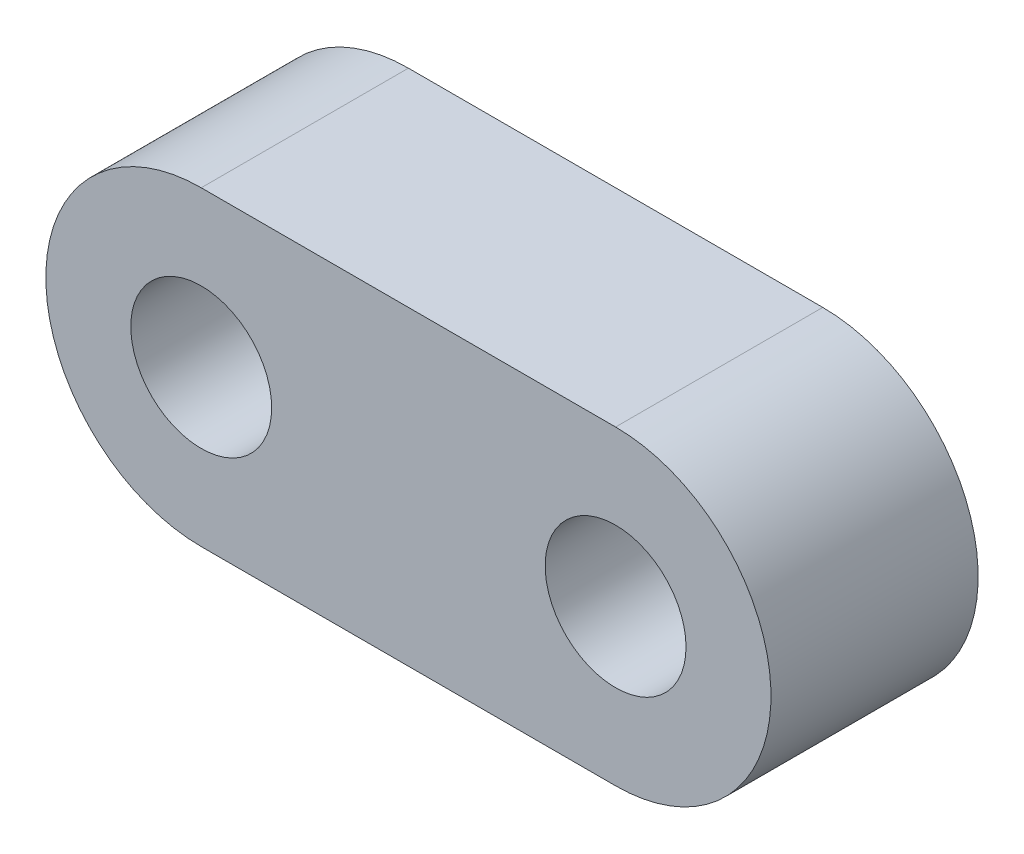
ISO-10303-21;
HEADER;
FILE_DESCRIPTION(('STEP AP214'),'2;1');
FILE_NAME('part.step','',(''),(''),'','','');
FILE_SCHEMA(('AUTOMOTIVE_DESIGN { 1 0 10303 214 1 1 1 1 }'));
ENDSEC;
DATA;
#1=APPLICATION_CONTEXT('core data for automotive mechanical design processes');
#2=APPLICATION_PROTOCOL_DEFINITION('international standard','automotive_design',2000,#1);
#3=PRODUCT_CONTEXT('',#1,'mechanical');
#4=PRODUCT('Part','Part','',(#3));
#5=PRODUCT_RELATED_PRODUCT_CATEGORY('part','',(#4));
#6=PRODUCT_DEFINITION_FORMATION('','',#4);
#7=PRODUCT_DEFINITION_CONTEXT('part definition',#1,'design');
#8=PRODUCT_DEFINITION('design','',#6,#7);
#9=PRODUCT_DEFINITION_SHAPE('','',#8);
#10=(LENGTH_UNIT() NAMED_UNIT(*) SI_UNIT(.MILLI.,.METRE.));
#11=(NAMED_UNIT(*) PLANE_ANGLE_UNIT() SI_UNIT($,.RADIAN.));
#12=(NAMED_UNIT(*) SI_UNIT($,.STERADIAN.) SOLID_ANGLE_UNIT());
#13=UNCERTAINTY_MEASURE_WITH_UNIT(LENGTH_MEASURE(1.E-05),#10,'distance_accuracy_value','');
#14=(GEOMETRIC_REPRESENTATION_CONTEXT(3) GLOBAL_UNCERTAINTY_ASSIGNED_CONTEXT((#13)) GLOBAL_UNIT_ASSIGNED_CONTEXT((#10,
#11,#12)) REPRESENTATION_CONTEXT('',''));
#15=CARTESIAN_POINT('',(0.,0.,0.));
#16=DIRECTION('',(0.,0.,1.));
#17=DIRECTION('',(1.,0.,0.));
#18=AXIS2_PLACEMENT_3D('',#15,#16,#17);
#19=CARTESIAN_POINT('',(0.,0.,6.35));
#20=DIRECTION('',(0.,0.,1.));
#21=DIRECTION('',(1.,0.,0.));
#22=AXIS2_PLACEMENT_3D('',#19,#20,#21);
#23=PLANE('',#22);
#24=CARTESIAN_POINT('',(12.7,0.,6.35));
#25=DIRECTION('',(0.,0.,1.));
#26=DIRECTION('',(1.,0.,0.));
#27=AXIS2_PLACEMENT_3D('',#24,#25,#26);
#28=CIRCLE('',#27,2.159);
#29=CARTESIAN_POINT('',(14.859,0.,6.35));
#30=VERTEX_POINT('',#29);
#31=EDGE_CURVE('E106',#30,#30,#28,.T.);
#32=ORIENTED_EDGE('',*,*,#31,.F.);
#33=EDGE_LOOP('',(#32));
#34=FACE_BOUND('',#33,.T.);
#35=CARTESIAN_POINT('',(0.,0.,6.35));
#36=DIRECTION('',(0.,0.,1.));
#37=DIRECTION('',(1.,0.,0.));
#38=AXIS2_PLACEMENT_3D('',#35,#36,#37);
#39=CIRCLE('',#38,4.7625);
#40=CARTESIAN_POINT('',(0.,4.7625,6.35));
#41=VERTEX_POINT('',#40);
#42=CARTESIAN_POINT('',(0.,-4.7625,6.35));
#43=VERTEX_POINT('',#42);
#44=EDGE_CURVE('E91',#41,#43,#39,.T.);
#45=ORIENTED_EDGE('',*,*,#44,.T.);
#46=DIRECTION('',(1.,0.,0.));
#47=VECTOR('',#46,1.);
#48=CARTESIAN_POINT('',(0.,-4.7625,6.35));
#49=LINE('',#48,#47);
#50=CARTESIAN_POINT('',(12.7,-4.7625,6.35));
#51=VERTEX_POINT('',#50);
#52=EDGE_CURVE('E86',#43,#51,#49,.T.);
#53=ORIENTED_EDGE('',*,*,#52,.T.);
#54=CARTESIAN_POINT('',(12.7,0.,6.35));
#55=DIRECTION('',(0.,0.,1.));
#56=DIRECTION('',(1.,0.,0.));
#57=AXIS2_PLACEMENT_3D('',#54,#55,#56);
#58=CIRCLE('',#57,4.7625);
#59=CARTESIAN_POINT('',(12.7,4.7625,6.35));
#60=VERTEX_POINT('',#59);
#61=EDGE_CURVE('E89',#51,#60,#58,.T.);
#62=ORIENTED_EDGE('',*,*,#61,.T.);
#63=DIRECTION('',(-1.,0.,0.));
#64=VECTOR('',#63,1.);
#65=CARTESIAN_POINT('',(0.,4.7625,6.35));
#66=LINE('',#65,#64);
#67=EDGE_CURVE('E56',#60,#41,#66,.T.);
#68=ORIENTED_EDGE('',*,*,#67,.T.);
#69=EDGE_LOOP('',(#45,#53,#62,#68));
#70=FACE_BOUND('',#69,.T.);
#71=CARTESIAN_POINT('',(0.,0.,6.35));
#72=DIRECTION('',(0.,0.,1.));
#73=DIRECTION('',(1.,0.,0.));
#74=AXIS2_PLACEMENT_3D('',#71,#72,#73);
#75=CIRCLE('',#74,2.159);
#76=CARTESIAN_POINT('',(2.159,0.,6.35));
#77=VERTEX_POINT('',#76);
#78=EDGE_CURVE('E121',#77,#77,#75,.T.);
#79=ORIENTED_EDGE('',*,*,#78,.F.);
#80=EDGE_LOOP('',(#79));
#81=FACE_BOUND('',#80,.T.);
#82=ADVANCED_FACE('F39',(#34,#70,#81),#23,.T.);
#83=CARTESIAN_POINT('',(0.,0.,0.));
#84=DIRECTION('',(0.,0.,1.));
#85=DIRECTION('',(1.,0.,0.));
#86=AXIS2_PLACEMENT_3D('',#83,#84,#85);
#87=PLANE('',#86);
#88=CARTESIAN_POINT('',(0.,0.,0.));
#89=DIRECTION('',(0.,0.,1.));
#90=DIRECTION('',(1.,0.,0.));
#91=AXIS2_PLACEMENT_3D('',#88,#89,#90);
#92=CIRCLE('',#91,4.7625);
#93=CARTESIAN_POINT('',(0.,4.7625,0.));
#94=VERTEX_POINT('',#93);
#95=CARTESIAN_POINT('',(0.,-4.7625,0.));
#96=VERTEX_POINT('',#95);
#97=EDGE_CURVE('E103',#94,#96,#92,.T.);
#98=ORIENTED_EDGE('',*,*,#97,.F.);
#99=DIRECTION('',(-1.,0.,0.));
#100=VECTOR('',#99,1.);
#101=CARTESIAN_POINT('',(0.,4.7625,0.));
#102=LINE('',#101,#100);
#103=CARTESIAN_POINT('',(12.7,4.7625,0.));
#104=VERTEX_POINT('',#103);
#105=EDGE_CURVE('E79',#104,#94,#102,.T.);
#106=ORIENTED_EDGE('',*,*,#105,.F.);
#107=CARTESIAN_POINT('',(12.7,0.,0.));
#108=DIRECTION('',(0.,0.,1.));
#109=DIRECTION('',(1.,0.,0.));
#110=AXIS2_PLACEMENT_3D('',#107,#108,#109);
#111=CIRCLE('',#110,4.7625);
#112=CARTESIAN_POINT('',(12.7,-4.7625,0.));
#113=VERTEX_POINT('',#112);
#114=EDGE_CURVE('E73',#113,#104,#111,.T.);
#115=ORIENTED_EDGE('',*,*,#114,.F.);
#116=DIRECTION('',(1.,0.,0.));
#117=VECTOR('',#116,1.);
#118=CARTESIAN_POINT('',(0.,-4.7625,0.));
#119=LINE('',#118,#117);
#120=EDGE_CURVE('E95',#96,#113,#119,.T.);
#121=ORIENTED_EDGE('',*,*,#120,.F.);
#122=EDGE_LOOP('',(#98,#106,#115,#121));
#123=FACE_BOUND('',#122,.T.);
#124=CARTESIAN_POINT('',(12.7,0.,0.));
#125=DIRECTION('',(0.,0.,1.));
#126=DIRECTION('',(1.,0.,0.));
#127=AXIS2_PLACEMENT_3D('',#124,#125,#126);
#128=CIRCLE('',#127,2.159);
#129=CARTESIAN_POINT('',(14.859,0.,0.));
#130=VERTEX_POINT('',#129);
#131=EDGE_CURVE('E118',#130,#130,#128,.T.);
#132=ORIENTED_EDGE('',*,*,#131,.T.);
#133=EDGE_LOOP('',(#132));
#134=FACE_BOUND('',#133,.T.);
#135=CARTESIAN_POINT('',(0.,0.,0.));
#136=DIRECTION('',(0.,0.,1.));
#137=DIRECTION('',(1.,0.,0.));
#138=AXIS2_PLACEMENT_3D('',#135,#136,#137);
#139=CIRCLE('',#138,2.159);
#140=CARTESIAN_POINT('',(2.159,0.,0.));
#141=VERTEX_POINT('',#140);
#142=EDGE_CURVE('E124',#141,#141,#139,.T.);
#143=ORIENTED_EDGE('',*,*,#142,.T.);
#144=EDGE_LOOP('',(#143));
#145=FACE_BOUND('',#144,.T.);
#146=ADVANCED_FACE('F114',(#123,#134,#145),#87,.F.);
#147=CARTESIAN_POINT('',(0.,0.,6.35));
#148=DIRECTION('',(0.,0.,-1.));
#149=DIRECTION('',(-1.,0.,0.));
#150=AXIS2_PLACEMENT_3D('',#147,#148,#149);
#151=CYLINDRICAL_SURFACE('',#150,4.7625);
#152=ORIENTED_EDGE('',*,*,#97,.T.);
#153=DIRECTION('',(0.,0.,-1.));
#154=VECTOR('',#153,1.);
#155=CARTESIAN_POINT('',(0.,-4.7625,6.35));
#156=LINE('',#155,#154);
#157=EDGE_CURVE('E11',#43,#96,#156,.T.);
#158=ORIENTED_EDGE('',*,*,#157,.F.);
#159=ORIENTED_EDGE('',*,*,#44,.F.);
#160=DIRECTION('',(0.,0.,-1.));
#161=VECTOR('',#160,1.);
#162=CARTESIAN_POINT('',(0.,4.7625,6.35));
#163=LINE('',#162,#161);
#164=EDGE_CURVE('E99',#41,#94,#163,.T.);
#165=ORIENTED_EDGE('',*,*,#164,.T.);
#166=EDGE_LOOP('',(#152,#158,#159,#165));
#167=FACE_BOUND('',#166,.T.);
#168=ADVANCED_FACE('F41',(#167),#151,.T.);
#169=CARTESIAN_POINT('',(0.,-4.7625,6.35));
#170=DIRECTION('',(0.,1.,0.));
#171=DIRECTION('',(0.,0.,1.));
#172=AXIS2_PLACEMENT_3D('',#169,#170,#171);
#173=PLANE('',#172);
#174=ORIENTED_EDGE('',*,*,#120,.T.);
#175=DIRECTION('',(0.,0.,-1.));
#176=VECTOR('',#175,1.);
#177=CARTESIAN_POINT('',(12.7,-4.7625,6.35));
#178=LINE('',#177,#176);
#179=EDGE_CURVE('E48',#51,#113,#178,.T.);
#180=ORIENTED_EDGE('',*,*,#179,.F.);
#181=ORIENTED_EDGE('',*,*,#52,.F.);
#182=ORIENTED_EDGE('',*,*,#157,.T.);
#183=EDGE_LOOP('',(#174,#180,#181,#182));
#184=FACE_BOUND('',#183,.T.);
#185=ADVANCED_FACE('F94',(#184),#173,.F.);
#186=CARTESIAN_POINT('',(12.7,0.,6.35));
#187=DIRECTION('',(0.,0.,-1.));
#188=DIRECTION('',(-1.,0.,0.));
#189=AXIS2_PLACEMENT_3D('',#186,#187,#188);
#190=CYLINDRICAL_SURFACE('',#189,4.7625);
#191=ORIENTED_EDGE('',*,*,#114,.T.);
#192=DIRECTION('',(0.,0.,-1.));
#193=VECTOR('',#192,1.);
#194=CARTESIAN_POINT('',(12.7,4.7625,6.35));
#195=LINE('',#194,#193);
#196=EDGE_CURVE('E96',#60,#104,#195,.T.);
#197=ORIENTED_EDGE('',*,*,#196,.F.);
#198=ORIENTED_EDGE('',*,*,#61,.F.);
#199=ORIENTED_EDGE('',*,*,#179,.T.);
#200=EDGE_LOOP('',(#191,#197,#198,#199));
#201=FACE_BOUND('',#200,.T.);
#202=ADVANCED_FACE('F97',(#201),#190,.T.);
#203=CARTESIAN_POINT('',(0.,4.7625,6.35));
#204=DIRECTION('',(0.,-1.,0.));
#205=DIRECTION('',(0.,0.,-1.));
#206=AXIS2_PLACEMENT_3D('',#203,#204,#205);
#207=PLANE('',#206);
#208=ORIENTED_EDGE('',*,*,#105,.T.);
#209=ORIENTED_EDGE('',*,*,#164,.F.);
#210=ORIENTED_EDGE('',*,*,#67,.F.);
#211=ORIENTED_EDGE('',*,*,#196,.T.);
#212=EDGE_LOOP('',(#208,#209,#210,#211));
#213=FACE_BOUND('',#212,.T.);
#214=ADVANCED_FACE('F111',(#213),#207,.F.);
#215=CARTESIAN_POINT('',(12.7,0.,6.35));
#216=DIRECTION('',(0.,0.,-1.));
#217=DIRECTION('',(-1.,0.,0.));
#218=AXIS2_PLACEMENT_3D('',#215,#216,#217);
#219=CYLINDRICAL_SURFACE('',#218,2.159);
#220=ORIENTED_EDGE('',*,*,#31,.T.);
#221=EDGE_LOOP('',(#220));
#222=FACE_BOUND('',#221,.T.);
#223=ORIENTED_EDGE('',*,*,#131,.F.);
#224=EDGE_LOOP('',(#223));
#225=FACE_BOUND('',#224,.T.);
#226=ADVANCED_FACE('F141',(#222,#225),#219,.F.);
#227=CARTESIAN_POINT('',(0.,0.,6.35));
#228=DIRECTION('',(0.,0.,-1.));
#229=DIRECTION('',(-1.,0.,0.));
#230=AXIS2_PLACEMENT_3D('',#227,#228,#229);
#231=CYLINDRICAL_SURFACE('',#230,2.159);
#232=ORIENTED_EDGE('',*,*,#78,.T.);
#233=EDGE_LOOP('',(#232));
#234=FACE_BOUND('',#233,.T.);
#235=ORIENTED_EDGE('',*,*,#142,.F.);
#236=EDGE_LOOP('',(#235));
#237=FACE_BOUND('',#236,.T.);
#238=ADVANCED_FACE('F130',(#234,#237),#231,.F.);
#239=CLOSED_SHELL('',(#82,#146,#168,#185,#202,#214,#226,#238));
#240=MANIFOLD_SOLID_BREP('B2',#239);
#241=ADVANCED_BREP_SHAPE_REPRESENTATION('',(#18,#240),#14);
#242=SHAPE_DEFINITION_REPRESENTATION(#9,#241);
ENDSEC;
END-ISO-10303-21;
